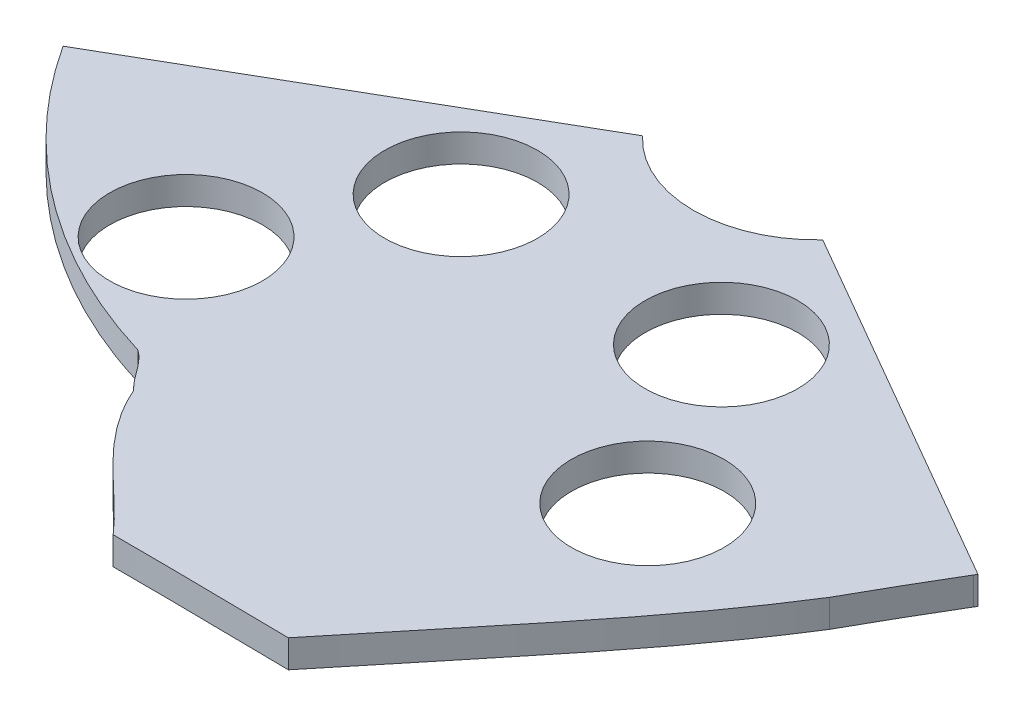
ISO-10303-21;
HEADER;
FILE_DESCRIPTION(('STEP AP214'),'2;1');
FILE_NAME('part.step','',(''),(''),'','','');
FILE_SCHEMA(('AUTOMOTIVE_DESIGN { 1 0 10303 214 1 1 1 1 }'));
ENDSEC;
DATA;
#1=APPLICATION_CONTEXT('core data for automotive mechanical design processes');
#2=APPLICATION_PROTOCOL_DEFINITION('international standard','automotive_design',2000,#1);
#3=PRODUCT_CONTEXT('',#1,'mechanical');
#4=PRODUCT('Part','Part','',(#3));
#5=PRODUCT_RELATED_PRODUCT_CATEGORY('part','',(#4));
#6=PRODUCT_DEFINITION_FORMATION('','',#4);
#7=PRODUCT_DEFINITION_CONTEXT('part definition',#1,'design');
#8=PRODUCT_DEFINITION('design','',#6,#7);
#9=PRODUCT_DEFINITION_SHAPE('','',#8);
#10=(LENGTH_UNIT() NAMED_UNIT(*) SI_UNIT(.MILLI.,.METRE.));
#11=(NAMED_UNIT(*) PLANE_ANGLE_UNIT() SI_UNIT($,.RADIAN.));
#12=(NAMED_UNIT(*) SI_UNIT($,.STERADIAN.) SOLID_ANGLE_UNIT());
#13=UNCERTAINTY_MEASURE_WITH_UNIT(LENGTH_MEASURE(1.E-05),#10,'distance_accuracy_value','');
#14=(GEOMETRIC_REPRESENTATION_CONTEXT(3) GLOBAL_UNCERTAINTY_ASSIGNED_CONTEXT((#13)) GLOBAL_UNIT_ASSIGNED_CONTEXT((#10,
#11,#12)) REPRESENTATION_CONTEXT('',''));
#15=CARTESIAN_POINT('',(0.,0.,0.));
#16=DIRECTION('',(0.,0.,1.));
#17=DIRECTION('',(1.,0.,0.));
#18=AXIS2_PLACEMENT_3D('',#15,#16,#17);
#19=CARTESIAN_POINT('',(-47.1310824648734,-71.7359999999999,62.7768448619572));
#20=DIRECTION('',(0.,-1.,0.));
#21=DIRECTION('',(0.,0.,-1.));
#22=AXIS2_PLACEMENT_3D('',#19,#20,#21);
#23=PLANE('',#22);
#24=CARTESIAN_POINT('',(18.75,-71.7359999999999,32.476));
#25=DIRECTION('',(0.,-1.,0.));
#26=DIRECTION('',(0.,0.,-1.));
#27=AXIS2_PLACEMENT_3D('',#24,#25,#26);
#28=CIRCLE('',#27,10.999845998306);
#29=CARTESIAN_POINT('',(18.75,-71.7359999999999,21.476154001694));
#30=VERTEX_POINT('',#29);
#31=EDGE_CURVE('E441',#30,#30,#28,.T.);
#32=ORIENTED_EDGE('',*,*,#31,.F.);
#33=EDGE_LOOP('',(#32));
#34=FACE_BOUND('',#33,.T.);
#35=CARTESIAN_POINT('',(-33.25,-71.7359999999999,57.591));
#36=DIRECTION('',(0.,-1.,0.));
#37=DIRECTION('',(0.,0.,-1.));
#38=AXIS2_PLACEMENT_3D('',#35,#36,#37);
#39=CIRCLE('',#38,10.999845998306);
#40=CARTESIAN_POINT('',(-33.25,-71.7359999999999,46.591154001694));
#41=VERTEX_POINT('',#40);
#42=EDGE_CURVE('E422',#41,#41,#39,.T.);
#43=ORIENTED_EDGE('',*,*,#42,.F.);
#44=EDGE_LOOP('',(#43));
#45=FACE_BOUND('',#44,.T.);
#46=CARTESIAN_POINT('',(-65.8942438215736,-71.7359999999999,42.6629141284689));
#47=CARTESIAN_POINT('',(-64.6413955635053,-71.7359999999999,44.59728764829));
#48=CARTESIAN_POINT('',(-63.3036796537157,-71.7359999999999,46.4776731400608));
#49=CARTESIAN_POINT('',(-60.4700762133835,-71.7359999999999,50.109948479271));
#50=CARTESIAN_POINT('',(-58.9724775941195,-71.7359999999999,51.8633522477695));
#51=CARTESIAN_POINT('',(-54.2563159243186,-71.7359999999999,56.917988390157));
#52=CARTESIAN_POINT('',(-50.8164013195822,-71.7359999999999,60.0103271048487));
#53=CARTESIAN_POINT('',(-43.4457636101648,-71.7359999999999,65.5433626190657));
#54=CARTESIAN_POINT('',(-39.5161704931453,-71.7359999999999,67.9856871996307));
#55=CARTESIAN_POINT('',(-33.3475212776179,-71.7359999999999,71.102012689813));
#56=CARTESIAN_POINT('',(-31.2442729667969,-71.7359999999999,72.0506458963915));
#57=CARTESIAN_POINT('',(-26.9642380054666,-71.7359999999999,73.7598534142659));
#58=CARTESIAN_POINT('',(-24.7877236211194,-71.7359999999999,74.5197083586423));
#59=CARTESIAN_POINT('',(-22.5811277652207,-71.7359999999999,75.1822390860664));
#60=B_SPLINE_CURVE_WITH_KNOTS('',3,(#46,#47,#48,#49,#50,#51,#52,#53,#54,#55,#56,#57,#58,#59),
.UNSPECIFIED.,.F.,.F.,(4,2,2,2,2,2,4),(1.39491762096711E-06,0.125001394917621,0.250001394917621,
0.500001394917621,0.750001394917621,0.875001394917621,1.),.UNSPECIFIED.);
#61=CARTESIAN_POINT('',(-22.5811277626985,-71.7359999999999,75.1822390776628));
#62=VERTEX_POINT('',#61);
#63=CARTESIAN_POINT('',(-65.8942438215736,-71.7359999999999,42.6629141284689));
#64=VERTEX_POINT('',#63);
#65=EDGE_CURVE('E378',#62,#64,#60,.F.);
#66=ORIENTED_EDGE('',*,*,#65,.T.);
#67=DIRECTION('',(0.866025113443951,0.,-0.500000502884138));
#68=VECTOR('',#67,1.);
#69=CARTESIAN_POINT('',(-65.8942438215736,-71.7359999999999,42.6629141284689));
#70=LINE('',#69,#68);
#71=CARTESIAN_POINT('',(-12.9766531358799,-71.7359999999999,12.1108879302399));
#72=VERTEX_POINT('',#71);
#73=EDGE_CURVE('E103',#64,#72,#70,.T.);
#74=ORIENTED_EDGE('',*,*,#73,.T.);
#75=CARTESIAN_POINT('',(0.,-71.7359999999999,0.));
#76=DIRECTION('',(0.,1.,0.));
#77=DIRECTION('',(0.,0.,-1.));
#78=AXIS2_PLACEMENT_3D('',#75,#76,#77);
#79=CIRCLE('',#78,17.7501305084715);
#80=CARTESIAN_POINT('',(12.9766531358511,-71.7359999999999,12.1108879302707));
#81=VERTEX_POINT('',#80);
#82=EDGE_CURVE('E272',#72,#81,#79,.T.);
#83=ORIENTED_EDGE('',*,*,#82,.T.);
#84=DIRECTION('',(0.866025113442766,0.,0.500000502886192));
#85=VECTOR('',#84,1.);
#86=CARTESIAN_POINT('',(12.9766531358511,-71.7359999999999,12.1108879302707));
#87=LINE('',#86,#85);
#88=CARTESIAN_POINT('',(65.8946490574719,-71.7359999999999,42.6631480920524));
#89=VERTEX_POINT('',#88);
#90=EDGE_CURVE('E249',#81,#89,#87,.T.);
#91=ORIENTED_EDGE('',*,*,#90,.T.);
#92=CARTESIAN_POINT('',(65.6318924245116,-71.7359999999999,43.0663081828138));
#93=CARTESIAN_POINT('',(65.7198896838521,-71.7359999999999,42.932189507071));
#94=CARTESIAN_POINT('',(65.8074758271438,-71.7359999999999,42.797801942139));
#95=CARTESIAN_POINT('',(65.8946490574719,-71.7359999999999,42.6631480920524));
#96=B_SPLINE_CURVE_WITH_KNOTS('',3,(#92,#93,#94,#95),.UNSPECIFIED.,.F.,.F.,(4,4),(0.,
0.999695723473644),.UNSPECIFIED.);
#97=CARTESIAN_POINT('',(65.6318924245119,-71.7359999999999,43.0663081828134));
#98=VERTEX_POINT('',#97);
#99=EDGE_CURVE('E244',#89,#98,#96,.F.);
#100=ORIENTED_EDGE('',*,*,#99,.T.);
#101=CARTESIAN_POINT('',(58.0687104771123,-71.7359999999999,56.2005206813061));
#102=CARTESIAN_POINT('',(60.1722051159026,-71.7359999999999,52.3125087639168));
#103=CARTESIAN_POINT('',(62.6017558263647,-71.7359999999999,48.238383568742));
#104=CARTESIAN_POINT('',(65.0824933789424,-71.7359999999999,44.0055322072259));
#105=CARTESIAN_POINT('',(65.3620033503782,-71.7359999999999,43.5277952980234));
#106=CARTESIAN_POINT('',(65.5176968402376,-71.7359999999999,43.2615361728797));
#107=CARTESIAN_POINT('',(65.5912335378284,-71.7359999999999,43.1358183374974));
#108=CARTESIAN_POINT('',(65.6318924245213,-71.7359999999999,43.0663081828188));
#109=B_SPLINE_CURVE_WITH_KNOTS('',3,(#101,#102,#103,#104,#105,#106,#107,#108),.UNSPECIFIED.,.F.,
.F.,(4,1,1,1,1,4),(-29.4651990795125,-25.9983553398907,-25.742856255887,-25.6151067167765,
-25.5640069012696,-25.5008134722674),.UNSPECIFIED.);
#110=CARTESIAN_POINT('',(58.068710477118,-71.7359999999999,56.2005206812956));
#111=VERTEX_POINT('',#110);
#112=EDGE_CURVE('E321',#98,#111,#109,.F.);
#113=ORIENTED_EDGE('',*,*,#112,.T.);
#114=CARTESIAN_POINT('',(24.130375517784,-71.7359999999999,100.241090371806));
#115=CARTESIAN_POINT('',(24.9043111436865,-71.7359999999999,99.2826721329746));
#116=CARTESIAN_POINT('',(26.4849414032411,-71.7359999999999,97.3252679007572));
#117=CARTESIAN_POINT('',(29.2987149930892,-71.7359999999999,93.8728986852188));
#118=CARTESIAN_POINT('',(32.5724826236708,-71.7359999999999,89.8847259286435));
#119=CARTESIAN_POINT('',(36.2671873102039,-71.7359999999999,85.3962204878607));
#120=CARTESIAN_POINT('',(39.3335159134359,-71.7359999999999,81.645422264559));
#121=CARTESIAN_POINT('',(41.7675003597505,-71.7359999999999,78.6295456299731));
#122=CARTESIAN_POINT('',(44.183826065234,-71.7359999999999,75.6012480960365));
#123=CARTESIAN_POINT('',(47.1635549613513,-71.7359999999999,71.7862460517024));
#124=CARTESIAN_POINT('',(50.6485868893252,-71.7359999999999,67.1410991854537));
#125=CARTESIAN_POINT('',(54.0158805598964,-71.7359999999999,62.4101683503268));
#126=CARTESIAN_POINT('',(56.4601277290054,-71.7359999999999,58.742380281409));
#127=CARTESIAN_POINT('',(57.7840176270259,-71.7359999999999,56.6546374378668));
#128=CARTESIAN_POINT('',(58.068710477118,-71.7359999999999,56.2005206812956));
#129=B_SPLINE_CURVE_WITH_KNOTS('',3,(#114,#115,#116,#117,#118,#119,#120,#121,#122,#123,#124,
#125,#126,#127,#128),.UNSPECIFIED.,.F.,.F.,(4,1,1,1,1,1,1,1,1,1,1,1,4),(0.169263015984021,
0.224443941915799,0.281960556139649,0.368764771643015,0.455569350300839,0.542373095236026,
0.585775244694473,0.629169063938801,0.715911894770024,0.802601993462127,0.889272486309101,
0.975992945989892,1.),.UNSPECIFIED.);
#130=CARTESIAN_POINT('',(24.130375517784,-71.7359999999999,100.241090371806));
#131=VERTEX_POINT('',#130);
#132=EDGE_CURVE('E129',#111,#131,#129,.F.);
#133=ORIENTED_EDGE('',*,*,#132,.T.);
#134=CARTESIAN_POINT('',(24.1303755177467,-71.7359999999999,100.241090371805));
#135=CARTESIAN_POINT('',(16.508361533209,-71.7359999999999,100.189027866263));
#136=CARTESIAN_POINT('',(7.97667623288478,-71.7359999999999,99.9868578914391));
#137=CARTESIAN_POINT('',(-0.890825507183887,-71.7359999999999,100.000861704455));
#138=CARTESIAN_POINT('',(-1.33742039261911,-71.736,100.002062391821));
#139=B_SPLINE_CURVE_WITH_KNOTS('',3,(#134,#135,#136,#137,#138),.UNSPECIFIED.,.F.,.F.,(4,1,4),
(1.32964670389729E-05,0.94972400513588,1.0000010448234),.UNSPECIFIED.);
#140=CARTESIAN_POINT('',(-1.33742039261914,-71.736,100.002062391821));
#141=VERTEX_POINT('',#140);
#142=EDGE_CURVE('E122',#131,#141,#139,.T.);
#143=ORIENTED_EDGE('',*,*,#142,.T.);
#144=CARTESIAN_POINT('',(-17.8511479049751,-71.7359999999999,80.5452798776183));
#145=CARTESIAN_POINT('',(-17.8174918743432,-71.7359999999999,80.624059663613));
#146=CARTESIAN_POINT('',(-17.7498796053171,-71.7359999999999,80.7823229443452));
#147=CARTESIAN_POINT('',(-17.5234949065348,-71.7359999999999,81.2916172430318));
#148=CARTESIAN_POINT('',(-17.1435747512602,-71.7359999999999,82.0814151777423));
#149=CARTESIAN_POINT('',(-16.3939321800935,-71.7359999999999,83.4669396584856));
#150=CARTESIAN_POINT('',(-15.342906448,-71.7359999999999,85.1372056526867));
#151=CARTESIAN_POINT('',(-13.9479819704468,-71.7359999999999,87.0283505308614));
#152=CARTESIAN_POINT('',(-12.6925930701013,-71.7359999999999,88.5279782177932));
#153=CARTESIAN_POINT('',(-11.6434923076902,-71.7359999999999,89.6900986407658));
#154=CARTESIAN_POINT('',(-10.5659723556349,-71.7359999999999,90.8325728795034));
#155=CARTESIAN_POINT('',(-9.17742924397825,-71.7359999999999,92.2246052640169));
#156=CARTESIAN_POINT('',(-7.47172423871944,-71.7359999999999,93.8569174236699));
#157=CARTESIAN_POINT('',(-5.7527906177986,-71.7359999999999,95.4760404655401));
#158=CARTESIAN_POINT('',(-4.32713375447059,-71.7359999999999,96.8448954058809));
#159=CARTESIAN_POINT('',(-3.21646537263792,-71.7359999999999,97.9597859059709));
#160=CARTESIAN_POINT('',(-2.54701614438708,-71.7359999999999,98.6589465604221));
#161=CARTESIAN_POINT('',(-2.04240500571773,-71.7359999999999,99.2059408943311));
#162=CARTESIAN_POINT('',(-1.68442856608542,-71.7359999999999,99.6031959691122));
#163=CARTESIAN_POINT('',(-1.45243736629048,-71.7359999999999,99.8698568325127));
#164=CARTESIAN_POINT('',(-1.33742039086623,-71.7359999999999,100.002062390296));
#165=B_SPLINE_CURVE_WITH_KNOTS('',3,(#144,#145,#146,#147,#148,#149,#150,#151,#152,#153,#154,
#155,#156,#157,#158,#159,#160,#161,#162,#163,#164),.UNSPECIFIED.,.F.,.F.,(4,1,1,1,1,1,1,1,1,1,1,
1,1,1,1,1,1,1,4),(-1.04563691039061E-10,0.010004210583072,0.0200977649767112,0.0650854645038581,
0.112308259416784,0.204007043492902,0.295266180018061,0.38654139555933,0.432273044499713,
0.478088062205558,0.569925335347918,0.661842455225799,0.753787764007906,0.845696991419321,
0.892632635737396,0.937557512176796,0.958727548093413,0.979539471836584,1.00000316402465),.UNSPECIFIED.);
#166=CARTESIAN_POINT('',(-17.8511479049751,-71.7359999999999,80.5452798776183));
#167=VERTEX_POINT('',#166);
#168=EDGE_CURVE('E126',#141,#167,#165,.F.);
#169=ORIENTED_EDGE('',*,*,#168,.T.);
#170=CARTESIAN_POINT('',(-22.5811277626985,-71.7359999999999,75.1822390776628));
#171=CARTESIAN_POINT('',(-22.516038303485,-71.7359999999999,75.2320188037198));
#172=CARTESIAN_POINT('',(-22.3910251349875,-71.7359999999999,75.3276275452352));
#173=CARTESIAN_POINT('',(-22.1683350529378,-71.7359999999999,75.5089711973434));
#174=CARTESIAN_POINT('',(-21.7856676058365,-71.7359999999999,75.8413221960591));
#175=CARTESIAN_POINT('',(-21.2657192692755,-71.7359999999999,76.3597109940921));
#176=CARTESIAN_POINT('',(-20.6791200431121,-71.7359999999999,77.0516470975075));
#177=CARTESIAN_POINT('',(-20.2234801974196,-71.7359999999999,77.6560140003167));
#178=CARTESIAN_POINT('',(-19.8657582153538,-71.7359999999999,78.1460899862871));
#179=CARTESIAN_POINT('',(-19.5078833116472,-71.7359999999999,78.6367695139378));
#180=CARTESIAN_POINT('',(-19.0520298070528,-71.7359999999999,79.2434719960803));
#181=CARTESIAN_POINT('',(-18.5635247329674,-71.7359999999999,79.8245328774133));
#182=CARTESIAN_POINT('',(-18.2061049318891,-71.7359999999999,80.2010547974002));
#183=CARTESIAN_POINT('',(-18.0019325959271,-71.7359999999999,80.4031392129246));
#184=CARTESIAN_POINT('',(-17.9031763162864,-71.7359999999999,80.4962345927212));
#185=CARTESIAN_POINT('',(-17.8511479049752,-71.7359999999999,80.5452798776184));
#186=B_SPLINE_CURVE_WITH_KNOTS('',3,(#170,#171,#172,#173,#174,#175,#176,#177,#178,#179,#180,
#181,#182,#183,#184,#185),.UNSPECIFIED.,.F.,.F.,(4,1,1,1,1,1,1,1,1,1,1,1,1,4),
(1.79800188937485E-05,0.0342819777587222,0.0658266527995001,0.120093174425607,0.246178917628165,
0.372369003643859,0.499112220875021,0.562602916101528,0.626093834537986,0.753076028245098,
0.879882757394803,0.943249091058549,0.970101770327288,1.),.UNSPECIFIED.);
#187=EDGE_CURVE('E51',#167,#62,#186,.F.);
#188=ORIENTED_EDGE('',*,*,#187,.T.);
#189=EDGE_LOOP('',(#66,#74,#83,#91,#100,#113,#133,#143,#169,#188));
#190=FACE_BOUND('',#189,.T.);
#191=CARTESIAN_POINT('',(33.25,-71.7359999999999,57.591));
#192=DIRECTION('',(0.,-1.,0.));
#193=DIRECTION('',(0.,0.,-1.));
#194=AXIS2_PLACEMENT_3D('',#191,#192,#193);
#195=CIRCLE('',#194,10.999845998306);
#196=CARTESIAN_POINT('',(33.25,-71.7359999999999,46.591154001694));
#197=VERTEX_POINT('',#196);
#198=EDGE_CURVE('E429',#197,#197,#195,.T.);
#199=ORIENTED_EDGE('',*,*,#198,.F.);
#200=EDGE_LOOP('',(#199));
#201=FACE_BOUND('',#200,.T.);
#202=CARTESIAN_POINT('',(-18.75,-71.7359999999999,32.476));
#203=DIRECTION('',(0.,-1.,0.));
#204=DIRECTION('',(0.,0.,-1.));
#205=AXIS2_PLACEMENT_3D('',#202,#203,#204);
#206=CIRCLE('',#205,10.999845998306);
#207=CARTESIAN_POINT('',(-18.75,-71.7359999999999,21.476154001694));
#208=VERTEX_POINT('',#207);
#209=EDGE_CURVE('E447',#208,#208,#206,.T.);
#210=ORIENTED_EDGE('',*,*,#209,.F.);
#211=EDGE_LOOP('',(#210));
#212=FACE_BOUND('',#211,.T.);
#213=ADVANCED_FACE('F30',(#34,#45,#190,#201,#212),#23,.T.);
#214=CARTESIAN_POINT('',(-47.1310824648734,-67.7359999999999,62.7768448619572));
#215=DIRECTION('',(0.,-1.,0.));
#216=DIRECTION('',(0.,0.,-1.));
#217=AXIS2_PLACEMENT_3D('',#214,#215,#216);
#218=PLANE('',#217);
#219=CARTESIAN_POINT('',(18.75,-67.7359999999999,32.476));
#220=DIRECTION('',(0.,-1.,0.));
#221=DIRECTION('',(0.,0.,-1.));
#222=AXIS2_PLACEMENT_3D('',#219,#220,#221);
#223=CIRCLE('',#222,10.999845998306);
#224=CARTESIAN_POINT('',(18.75,-67.7359999999999,21.476154001694));
#225=VERTEX_POINT('',#224);
#226=EDGE_CURVE('E444',#225,#225,#223,.T.);
#227=ORIENTED_EDGE('',*,*,#226,.T.);
#228=EDGE_LOOP('',(#227));
#229=FACE_BOUND('',#228,.T.);
#230=CARTESIAN_POINT('',(-33.25,-67.7359999999999,57.591));
#231=DIRECTION('',(0.,-1.,0.));
#232=DIRECTION('',(0.,0.,-1.));
#233=AXIS2_PLACEMENT_3D('',#230,#231,#232);
#234=CIRCLE('',#233,10.999845998306);
#235=CARTESIAN_POINT('',(-33.25,-67.7359999999999,46.591154001694));
#236=VERTEX_POINT('',#235);
#237=EDGE_CURVE('E424',#236,#236,#234,.T.);
#238=ORIENTED_EDGE('',*,*,#237,.T.);
#239=EDGE_LOOP('',(#238));
#240=FACE_BOUND('',#239,.T.);
#241=CARTESIAN_POINT('',(-22.5811277652207,-67.7359999999999,75.1822390860664));
#242=CARTESIAN_POINT('',(-24.7877236211194,-67.7359999999999,74.5197083586423));
#243=CARTESIAN_POINT('',(-26.9642380054666,-67.7359999999999,73.7598534142659));
#244=CARTESIAN_POINT('',(-31.2442729667969,-67.7359999999999,72.0506458963915));
#245=CARTESIAN_POINT('',(-33.3475212776179,-67.7359999999999,71.102012689813));
#246=CARTESIAN_POINT('',(-39.5161704931453,-67.7359999999999,67.9856871996307));
#247=CARTESIAN_POINT('',(-43.4457636101648,-67.7359999999999,65.5433626190657));
#248=CARTESIAN_POINT('',(-50.8164013195822,-67.7359999999999,60.0103271048487));
#249=CARTESIAN_POINT('',(-54.2563159243186,-67.7359999999999,56.917988390157));
#250=CARTESIAN_POINT('',(-58.9724775941195,-67.7359999999999,51.8633522477695));
#251=CARTESIAN_POINT('',(-60.4700762133835,-67.7359999999999,50.109948479271));
#252=CARTESIAN_POINT('',(-63.3036796537157,-67.7359999999999,46.4776731400608));
#253=CARTESIAN_POINT('',(-64.6413955635053,-67.7359999999999,44.59728764829));
#254=CARTESIAN_POINT('',(-65.8942438215736,-67.7359999999999,42.6629141284689));
#255=B_SPLINE_CURVE_WITH_KNOTS('',3,(#241,#242,#243,#244,#245,#246,#247,#248,#249,#250,#251,
#252,#253,#254),.UNSPECIFIED.,.F.,.F.,(4,2,2,2,2,2,4),(1.39491762096184E-06,0.125,0.25,0.5,0.75,
0.875,1.),.UNSPECIFIED.);
#256=CARTESIAN_POINT('',(-22.5811277626985,-67.7359999999999,75.1822390776628));
#257=VERTEX_POINT('',#256);
#258=CARTESIAN_POINT('',(-65.8942438215736,-67.7359999999999,42.6629141284689));
#259=VERTEX_POINT('',#258);
#260=EDGE_CURVE('E405',#257,#259,#255,.T.);
#261=ORIENTED_EDGE('',*,*,#260,.F.);
#262=CARTESIAN_POINT('',(-17.8511479049752,-67.7359999999997,80.5452798776184));
#263=CARTESIAN_POINT('',(-17.9031763162864,-67.7359999999997,80.4962345927212));
#264=CARTESIAN_POINT('',(-18.0019325959271,-67.7359999999997,80.4031392129246));
#265=CARTESIAN_POINT('',(-18.2061049318891,-67.7359999999997,80.2010547974002));
#266=CARTESIAN_POINT('',(-18.5635247329674,-67.7359999999997,79.8245328774133));
#267=CARTESIAN_POINT('',(-19.0520298070528,-67.7359999999997,79.2434719960803));
#268=CARTESIAN_POINT('',(-19.5078833116472,-67.7359999999997,78.6367695139378));
#269=CARTESIAN_POINT('',(-19.8657582153538,-67.7359999999997,78.1460899862871));
#270=CARTESIAN_POINT('',(-20.2234801974196,-67.7359999999997,77.6560140003167));
#271=CARTESIAN_POINT('',(-20.6791200431121,-67.7359999999997,77.0516470975075));
#272=CARTESIAN_POINT('',(-21.2657192692755,-67.7359999999997,76.3597109940921));
#273=CARTESIAN_POINT('',(-21.7856676058365,-67.7359999999997,75.8413221960591));
#274=CARTESIAN_POINT('',(-22.1683350529378,-67.7359999999997,75.5089711973434));
#275=CARTESIAN_POINT('',(-22.3910251349875,-67.7359999999997,75.3276275452352));
#276=CARTESIAN_POINT('',(-22.516038303485,-67.7359999999997,75.2320188037198));
#277=CARTESIAN_POINT('',(-22.5811277626985,-67.7359999999997,75.1822390776628));
#278=B_SPLINE_CURVE_WITH_KNOTS('',3,(#262,#263,#264,#265,#266,#267,#268,#269,#270,#271,#272,
#273,#274,#275,#276,#277),.UNSPECIFIED.,.F.,.F.,(4,1,1,1,1,1,1,1,1,1,1,1,1,4),
(1.79800188938065E-05,0.0299162096916062,0.0567688889603452,0.120135222624091,0.246941951773795,
0.373924145480908,0.437415063917365,0.500905759143873,0.627648976375035,0.753839062390729,
0.879924805593287,0.934191327219394,0.965736002260172,1.),.UNSPECIFIED.);
#279=CARTESIAN_POINT('',(-17.8511479049751,-67.7359999999999,80.5452798776183));
#280=VERTEX_POINT('',#279);
#281=EDGE_CURVE('E94',#280,#257,#278,.T.);
#282=ORIENTED_EDGE('',*,*,#281,.F.);
#283=CARTESIAN_POINT('',(-1.33742039086623,-67.7359999999999,100.002062390296));
#284=CARTESIAN_POINT('',(-1.45243736629048,-67.7359999999999,99.8698568325127));
#285=CARTESIAN_POINT('',(-1.68442856608542,-67.7359999999999,99.6031959691122));
#286=CARTESIAN_POINT('',(-2.04240500571773,-67.7359999999999,99.2059408943311));
#287=CARTESIAN_POINT('',(-2.54701614438708,-67.7359999999999,98.6589465604221));
#288=CARTESIAN_POINT('',(-3.21646537263792,-67.7359999999999,97.9597859059709));
#289=CARTESIAN_POINT('',(-4.32713375447059,-67.7359999999999,96.8448954058809));
#290=CARTESIAN_POINT('',(-5.7527906177986,-67.7359999999999,95.4760404655401));
#291=CARTESIAN_POINT('',(-7.47172423871944,-67.7359999999999,93.8569174236699));
#292=CARTESIAN_POINT('',(-9.17742924397825,-67.7359999999999,92.2246052640169));
#293=CARTESIAN_POINT('',(-10.5659723556349,-67.7359999999999,90.8325728795034));
#294=CARTESIAN_POINT('',(-11.6434923076902,-67.7359999999999,89.6900986407658));
#295=CARTESIAN_POINT('',(-12.6925930701013,-67.7359999999999,88.5279782177932));
#296=CARTESIAN_POINT('',(-13.9479819704468,-67.7359999999999,87.0283505308614));
#297=CARTESIAN_POINT('',(-15.342906448,-67.7359999999999,85.1372056526867));
#298=CARTESIAN_POINT('',(-16.3939321800935,-67.7359999999999,83.4669396584856));
#299=CARTESIAN_POINT('',(-17.1435747512602,-67.7359999999999,82.0814151777423));
#300=CARTESIAN_POINT('',(-17.5234949065348,-67.7359999999999,81.2916172430318));
#301=CARTESIAN_POINT('',(-17.7498796053171,-67.7359999999999,80.7823229443452));
#302=CARTESIAN_POINT('',(-17.8174918743432,-67.7359999999999,80.624059663613));
#303=CARTESIAN_POINT('',(-17.8511479049751,-67.7359999999999,80.5452798776183));
#304=B_SPLINE_CURVE_WITH_KNOTS('',3,(#283,#284,#285,#286,#287,#288,#289,#290,#291,#292,#293,
#294,#295,#296,#297,#298,#299,#300,#301,#302,#303),.UNSPECIFIED.,.F.,.F.,(4,1,1,1,1,1,1,1,1,1,1,
1,1,1,1,1,1,1,4),(-1.04563656949532E-10,0.0204636920835041,0.0412756158266749,
0.0624456517432918,0.107370528182692,0.154306172500768,0.246215399912182,0.338160708694289,
0.43007782857217,0.52191510171453,0.567730119420375,0.613461768360758,0.704736983902027,
0.795996120427186,0.887694904503304,0.93491769941623,0.979905398943377,0.989998953337016,
1.00000316402465),.UNSPECIFIED.);
#305=CARTESIAN_POINT('',(-1.33742039261914,-67.736,100.002062391821));
#306=VERTEX_POINT('',#305);
#307=EDGE_CURVE('E87',#306,#280,#304,.T.);
#308=ORIENTED_EDGE('',*,*,#307,.F.);
#309=CARTESIAN_POINT('',(24.1303755177467,-67.7359999999999,100.241090371805));
#310=CARTESIAN_POINT('',(16.508361533209,-67.7359999999999,100.189027866263));
#311=CARTESIAN_POINT('',(7.97667623288478,-67.7359999999999,99.9868578914391));
#312=CARTESIAN_POINT('',(-0.890825507183887,-67.7359999999999,100.000861704455));
#313=CARTESIAN_POINT('',(-1.33742039261911,-67.736,100.002062391821));
#314=B_SPLINE_CURVE_WITH_KNOTS('',3,(#309,#310,#311,#312,#313),.UNSPECIFIED.,.F.,.F.,(4,1,4),
(1.32964670389729E-05,0.94972400513588,1.0000010448234),.UNSPECIFIED.);
#315=CARTESIAN_POINT('',(24.130375517784,-67.7359999999999,100.241090371806));
#316=VERTEX_POINT('',#315);
#317=EDGE_CURVE('E138',#316,#306,#314,.T.);
#318=ORIENTED_EDGE('',*,*,#317,.F.);
#319=CARTESIAN_POINT('',(58.068710477118,-67.7359999999999,56.2005206812956));
#320=CARTESIAN_POINT('',(57.7840176270259,-67.7359999999999,56.6546374378668));
#321=CARTESIAN_POINT('',(56.4601277290054,-67.7359999999999,58.742380281409));
#322=CARTESIAN_POINT('',(54.0158805598964,-67.7359999999999,62.4101683503268));
#323=CARTESIAN_POINT('',(50.6485868893252,-67.7359999999999,67.1410991854537));
#324=CARTESIAN_POINT('',(47.1635549613513,-67.7359999999999,71.7862460517024));
#325=CARTESIAN_POINT('',(44.183826065234,-67.7359999999999,75.6012480960365));
#326=CARTESIAN_POINT('',(41.7675003597505,-67.7359999999999,78.6295456299731));
#327=CARTESIAN_POINT('',(39.3335159134359,-67.7359999999999,81.645422264559));
#328=CARTESIAN_POINT('',(36.2671873102039,-67.7359999999999,85.3962204878607));
#329=CARTESIAN_POINT('',(32.5724826236708,-67.7359999999999,89.8847259286435));
#330=CARTESIAN_POINT('',(29.2987149930892,-67.7359999999999,93.8728986852188));
#331=CARTESIAN_POINT('',(26.4849414032411,-67.7359999999999,97.3252679007572));
#332=CARTESIAN_POINT('',(24.9043111436865,-67.7359999999999,99.2826721329746));
#333=CARTESIAN_POINT('',(24.130375517784,-67.7359999999999,100.241090371806));
#334=B_SPLINE_CURVE_WITH_KNOTS('',3,(#319,#320,#321,#322,#323,#324,#325,#326,#327,#328,#329,
#330,#331,#332,#333),.UNSPECIFIED.,.F.,.F.,(4,1,1,1,1,1,1,1,1,1,1,1,4),(0.169263015984021,
0.193270069994129,0.27999052967492,0.366661022521894,0.453351121213997,0.54009395204522,
0.583487771289547,0.626889920747995,0.713693665683182,0.800498244341005,0.887302459844372,
0.944819074068222,1.),.UNSPECIFIED.);
#335=CARTESIAN_POINT('',(58.068710477118,-67.7359999999999,56.2005206812956));
#336=VERTEX_POINT('',#335);
#337=EDGE_CURVE('E312',#336,#316,#334,.T.);
#338=ORIENTED_EDGE('',*,*,#337,.F.);
#339=CARTESIAN_POINT('',(65.6318924245213,-67.7359999999999,43.0663081828188));
#340=CARTESIAN_POINT('',(65.5912335378284,-67.7359999999999,43.1358183374974));
#341=CARTESIAN_POINT('',(65.5176968402376,-67.7359999999999,43.2615361728797));
#342=CARTESIAN_POINT('',(65.3620033503782,-67.7359999999999,43.5277952980234));
#343=CARTESIAN_POINT('',(65.0824933789424,-67.7359999999999,44.0055322072259));
#344=CARTESIAN_POINT('',(62.6017558263647,-67.7359999999999,48.238383568742));
#345=CARTESIAN_POINT('',(60.1722051159026,-67.7359999999999,52.3125087639168));
#346=CARTESIAN_POINT('',(58.0687104771123,-67.7359999999999,56.2005206813061));
#347=B_SPLINE_CURVE_WITH_KNOTS('',3,(#339,#340,#341,#342,#343,#344,#345,#346),.UNSPECIFIED.,.F.,
.F.,(4,1,1,1,1,4),(-29.4651990795125,-29.4020056505103,-29.3509058350034,-29.2231562958928,
-28.9676572118892,-25.5008134722674),.UNSPECIFIED.);
#348=CARTESIAN_POINT('',(65.6318924245119,-67.7359999999999,43.0663081828134));
#349=VERTEX_POINT('',#348);
#350=EDGE_CURVE('E327',#349,#336,#347,.T.);
#351=ORIENTED_EDGE('',*,*,#350,.F.);
#352=CARTESIAN_POINT('',(65.8946490574719,-67.7359999999999,42.6631480920524));
#353=CARTESIAN_POINT('',(65.8074758271438,-67.7359999999999,42.797801942139));
#354=CARTESIAN_POINT('',(65.7198896838521,-67.7359999999999,42.932189507071));
#355=CARTESIAN_POINT('',(65.6318924245116,-67.7359999999999,43.0663081828138));
#356=B_SPLINE_CURVE_WITH_KNOTS('',3,(#352,#353,#354,#355),.UNSPECIFIED.,.F.,.F.,(4,4),(0.,
0.999695723473644),.UNSPECIFIED.);
#357=CARTESIAN_POINT('',(65.8946490574719,-67.7359999999999,42.6631480920524));
#358=VERTEX_POINT('',#357);
#359=EDGE_CURVE('E363',#358,#349,#356,.T.);
#360=ORIENTED_EDGE('',*,*,#359,.F.);
#361=DIRECTION('',(0.866025113442766,0.,0.500000502886192));
#362=VECTOR('',#361,1.);
#363=CARTESIAN_POINT('',(12.9766531358511,-67.7359999999999,12.1108879302707));
#364=LINE('',#363,#362);
#365=CARTESIAN_POINT('',(12.9766531358511,-67.7359999999999,12.1108879302707));
#366=VERTEX_POINT('',#365);
#367=EDGE_CURVE('E188',#366,#358,#364,.T.);
#368=ORIENTED_EDGE('',*,*,#367,.F.);
#369=CARTESIAN_POINT('',(0.,-67.7359999999999,0.));
#370=DIRECTION('',(0.,1.,0.));
#371=DIRECTION('',(0.,0.,-1.));
#372=AXIS2_PLACEMENT_3D('',#369,#370,#371);
#373=CIRCLE('',#372,17.7501305084715);
#374=CARTESIAN_POINT('',(-12.9766531358799,-67.7359999999999,12.1108879302399));
#375=VERTEX_POINT('',#374);
#376=EDGE_CURVE('E183',#375,#366,#373,.T.);
#377=ORIENTED_EDGE('',*,*,#376,.F.);
#378=DIRECTION('',(0.866025113443951,0.,-0.500000502884138));
#379=VECTOR('',#378,1.);
#380=CARTESIAN_POINT('',(-65.8942438215736,-67.7359999999999,42.6629141284689));
#381=LINE('',#380,#379);
#382=EDGE_CURVE('E189',#259,#375,#381,.T.);
#383=ORIENTED_EDGE('',*,*,#382,.F.);
#384=EDGE_LOOP('',(#261,#282,#308,#318,#338,#351,#360,#368,#377,#383));
#385=FACE_BOUND('',#384,.T.);
#386=CARTESIAN_POINT('',(33.25,-67.7359999999999,57.591));
#387=DIRECTION('',(0.,-1.,0.));
#388=DIRECTION('',(0.,0.,-1.));
#389=AXIS2_PLACEMENT_3D('',#386,#387,#388);
#390=CIRCLE('',#389,10.999845998306);
#391=CARTESIAN_POINT('',(33.25,-67.7359999999999,46.591154001694));
#392=VERTEX_POINT('',#391);
#393=EDGE_CURVE('E432',#392,#392,#390,.T.);
#394=ORIENTED_EDGE('',*,*,#393,.T.);
#395=EDGE_LOOP('',(#394));
#396=FACE_BOUND('',#395,.T.);
#397=CARTESIAN_POINT('',(-18.75,-67.7359999999999,32.476));
#398=DIRECTION('',(0.,-1.,0.));
#399=DIRECTION('',(0.,0.,-1.));
#400=AXIS2_PLACEMENT_3D('',#397,#398,#399);
#401=CIRCLE('',#400,10.999845998306);
#402=CARTESIAN_POINT('',(-18.75,-67.7359999999999,21.476154001694));
#403=VERTEX_POINT('',#402);
#404=EDGE_CURVE('E450',#403,#403,#401,.T.);
#405=ORIENTED_EDGE('',*,*,#404,.T.);
#406=EDGE_LOOP('',(#405));
#407=FACE_BOUND('',#406,.T.);
#408=ADVANCED_FACE('F208',(#229,#240,#385,#396,#407),#218,.F.);
#409=CARTESIAN_POINT('',(-22.5810538919185,-71.7359999999999,75.1822612664964));
#410=CARTESIAN_POINT('',(-24.7876750436405,-71.7359999999999,74.5197253177805));
#411=CARTESIAN_POINT('',(-26.9642141241486,-71.7359999999999,73.7598629511338));
#412=CARTESIAN_POINT('',(-31.2442729667969,-71.7359999999999,72.0506458963915));
#413=CARTESIAN_POINT('',(-33.3475212776179,-71.7359999999999,71.102012689813));
#414=CARTESIAN_POINT('',(-39.5161704931453,-71.7359999999999,67.9856871996307));
#415=CARTESIAN_POINT('',(-43.4457636101648,-71.7359999999999,65.5433626190657));
#416=CARTESIAN_POINT('',(-50.8164013195822,-71.7359999999999,60.0103271048487));
#417=CARTESIAN_POINT('',(-54.2563159243186,-71.7359999999999,56.917988390157));
#418=CARTESIAN_POINT('',(-58.9724775941195,-71.7359999999999,51.8633522477695));
#419=CARTESIAN_POINT('',(-60.4700762133835,-71.7359999999999,50.109948479271));
#420=CARTESIAN_POINT('',(-63.3036796537157,-71.7359999999999,46.4776731400608));
#421=CARTESIAN_POINT('',(-64.6413955635053,-71.7359999999999,44.59728764829));
#422=CARTESIAN_POINT('',(-65.8942438215736,-71.7359999999999,42.6629141284689));
#423=B_SPLINE_CURVE_WITH_KNOTS('',3,(#409,#410,#411,#412,#413,#414,#415,#416,#417,#418,#419,
#420,#421,#422),.UNSPECIFIED.,.F.,.F.,(4,2,2,2,2,2,4),(0.,0.125,0.25,0.5,0.75,0.875,1.),.UNSPECIFIED.);
#424=DIRECTION('',(0.,1.,0.));
#425=VECTOR('',#424,1.);
#426=SURFACE_OF_LINEAR_EXTRUSION('',#423,#425);
#427=ORIENTED_EDGE('',*,*,#260,.T.);
#428=DIRECTION('',(0.,1.,0.));
#429=VECTOR('',#428,1.);
#430=CARTESIAN_POINT('',(-65.8942438215736,-71.7359999999999,42.6629141284689));
#431=LINE('',#430,#429);
#432=EDGE_CURVE('E11',#64,#259,#431,.T.);
#433=ORIENTED_EDGE('',*,*,#432,.F.);
#434=ORIENTED_EDGE('',*,*,#65,.F.);
#435=DIRECTION('',(0.,1.,0.));
#436=VECTOR('',#435,1.);
#437=CARTESIAN_POINT('',(-22.5811277626985,-71.7359999999999,75.1822390776628));
#438=LINE('',#437,#436);
#439=EDGE_CURVE('E652',#62,#257,#438,.T.);
#440=ORIENTED_EDGE('',*,*,#439,.T.);
#441=EDGE_LOOP('',(#427,#433,#434,#440));
#442=FACE_BOUND('',#441,.T.);
#443=ADVANCED_FACE('F32',(#442),#426,.F.);
#444=CARTESIAN_POINT('',(-65.8942438215736,-71.7359999999999,42.6629141284689));
#445=DIRECTION('',(0.500000502884138,0.,0.866025113443951));
#446=DIRECTION('',(0.866025113443951,0.,-0.500000502884138));
#447=AXIS2_PLACEMENT_3D('',#444,#445,#446);
#448=PLANE('',#447);
#449=ORIENTED_EDGE('',*,*,#382,.T.);
#450=DIRECTION('',(0.,1.,0.));
#451=VECTOR('',#450,1.);
#452=CARTESIAN_POINT('',(-12.9766531358799,-71.7359999999999,12.1108879302399));
#453=LINE('',#452,#451);
#454=EDGE_CURVE('E42',#72,#375,#453,.T.);
#455=ORIENTED_EDGE('',*,*,#454,.F.);
#456=ORIENTED_EDGE('',*,*,#73,.F.);
#457=ORIENTED_EDGE('',*,*,#432,.T.);
#458=EDGE_LOOP('',(#449,#455,#456,#457));
#459=FACE_BOUND('',#458,.T.);
#460=ADVANCED_FACE('F469',(#459),#448,.F.);
#461=CARTESIAN_POINT('',(0.,-71.7359999999999,0.));
#462=DIRECTION('',(0.,1.,0.));
#463=DIRECTION('',(0.,0.,1.));
#464=AXIS2_PLACEMENT_3D('',#461,#462,#463);
#465=CYLINDRICAL_SURFACE('',#464,17.7501305084715);
#466=ORIENTED_EDGE('',*,*,#376,.T.);
#467=DIRECTION('',(0.,1.,0.));
#468=VECTOR('',#467,1.);
#469=CARTESIAN_POINT('',(12.9766531358511,-71.7359999999999,12.1108879302707));
#470=LINE('',#469,#468);
#471=EDGE_CURVE('E190',#81,#366,#470,.T.);
#472=ORIENTED_EDGE('',*,*,#471,.F.);
#473=ORIENTED_EDGE('',*,*,#82,.F.);
#474=ORIENTED_EDGE('',*,*,#454,.T.);
#475=EDGE_LOOP('',(#466,#472,#473,#474));
#476=FACE_BOUND('',#475,.T.);
#477=ADVANCED_FACE('F517',(#476),#465,.F.);
#478=CARTESIAN_POINT('',(12.9766531358511,-71.7359999999999,12.1108879302707));
#479=DIRECTION('',(-0.500000502886192,0.,0.866025113442766));
#480=DIRECTION('',(0.866025113442766,0.,0.500000502886192));
#481=AXIS2_PLACEMENT_3D('',#478,#479,#480);
#482=PLANE('',#481);
#483=ORIENTED_EDGE('',*,*,#367,.T.);
#484=DIRECTION('',(0.,1.,0.));
#485=VECTOR('',#484,1.);
#486=CARTESIAN_POINT('',(65.8946490574719,-71.7359999999999,42.6631480920524));
#487=LINE('',#486,#485);
#488=EDGE_CURVE('E193',#89,#358,#487,.T.);
#489=ORIENTED_EDGE('',*,*,#488,.F.);
#490=ORIENTED_EDGE('',*,*,#90,.F.);
#491=ORIENTED_EDGE('',*,*,#471,.T.);
#492=EDGE_LOOP('',(#483,#489,#490,#491));
#493=FACE_BOUND('',#492,.T.);
#494=ADVANCED_FACE('F263',(#493),#482,.F.);
#495=CARTESIAN_POINT('',(65.8946490574719,-71.7359999999999,42.6631480920524));
#496=CARTESIAN_POINT('',(65.8074492943028,-71.7359999999999,42.7978429266154));
#497=CARTESIAN_POINT('',(65.7198363667759,-71.7359999999999,42.9322713139012));
#498=CARTESIAN_POINT('',(65.6318120734472,-71.7359999999999,43.0664306474966));
#499=B_SPLINE_CURVE_WITH_KNOTS('',3,(#495,#496,#497,#498),.UNSPECIFIED.,.F.,.F.,(4,4),(0.,1.),.UNSPECIFIED.);
#500=DIRECTION('',(0.,1.,0.));
#501=VECTOR('',#500,1.);
#502=SURFACE_OF_LINEAR_EXTRUSION('',#499,#501);
#503=ORIENTED_EDGE('',*,*,#359,.T.);
#504=DIRECTION('',(0.,1.,0.));
#505=VECTOR('',#504,1.);
#506=CARTESIAN_POINT('',(65.6318924245119,-71.7359999999999,43.0663081828134));
#507=LINE('',#506,#505);
#508=EDGE_CURVE('E329',#98,#349,#507,.T.);
#509=ORIENTED_EDGE('',*,*,#508,.F.);
#510=ORIENTED_EDGE('',*,*,#99,.F.);
#511=ORIENTED_EDGE('',*,*,#488,.T.);
#512=EDGE_LOOP('',(#503,#509,#510,#511));
#513=FACE_BOUND('',#512,.T.);
#514=ADVANCED_FACE('F251',(#513),#502,.F.);
#515=CARTESIAN_POINT('',(-1569.4554932376,-71.7359999999999,-1104.5505998346));
#516=CARTESIAN_POINT('',(123.468603889664,-71.7359999999999,-50.0184783711937));
#517=CARTESIAN_POINT('',(93.1876607899681,-71.7359999999999,-4.05823551870026));
#518=CARTESIAN_POINT('',(65.3620033503782,-71.7359999999999,43.5277952980234));
#519=CARTESIAN_POINT('',(65.0824933789424,-71.7359999999999,44.0055322072259));
#520=CARTESIAN_POINT('',(17.8098349572808,-71.7359999999999,124.666276168109));
#521=CARTESIAN_POINT('',(-41.4303505938273,-71.7359999999999,198.11129383452));
#522=CARTESIAN_POINT('',(1625.65821493319,-71.7359999999999,1284.82315736767));
#523=B_SPLINE_CURVE_WITH_KNOTS('',3,(#515,#516,#517,#518,#519,#520,#521,#522),.UNSPECIFIED.,.F.,
.F.,(4,1,1,1,1,4),(-72.4812243680169,-29.4020056505103,-29.3509058350034,-29.2231562958928,
-28.9676572118892,44.0160252885046),.UNSPECIFIED.);
#524=DIRECTION('',(0.,1.,0.));
#525=VECTOR('',#524,1.);
#526=SURFACE_OF_LINEAR_EXTRUSION('',#523,#525);
#527=ORIENTED_EDGE('',*,*,#350,.T.);
#528=DIRECTION('',(0.,1.,0.));
#529=VECTOR('',#528,1.);
#530=CARTESIAN_POINT('',(58.068710477118,-71.7359999999999,56.2005206812956));
#531=LINE('',#530,#529);
#532=EDGE_CURVE('E326',#111,#336,#531,.T.);
#533=ORIENTED_EDGE('',*,*,#532,.F.);
#534=ORIENTED_EDGE('',*,*,#112,.F.);
#535=ORIENTED_EDGE('',*,*,#508,.T.);
#536=EDGE_LOOP('',(#527,#533,#534,#535));
#537=FACE_BOUND('',#536,.T.);
#538=ADVANCED_FACE('F262',(#537),#526,.F.);
#539=CARTESIAN_POINT('',(63.6976006942556,-71.7359999999999,46.3636576068528));
#540=CARTESIAN_POINT('',(63.5965735405576,-71.7359999999999,46.55902615376));
#541=CARTESIAN_POINT('',(63.3942099302679,-71.7359999999999,46.9503613843595));
#542=CARTESIAN_POINT('',(62.3105419142047,-71.7359999999999,49.010683256892));
#543=CARTESIAN_POINT('',(60.3114283228076,-71.7359999999999,52.5859545017264));
#544=CARTESIAN_POINT('',(57.264807201841,-71.7359999999999,57.5348944726619));
#545=CARTESIAN_POINT('',(54.0158805598964,-71.7359999999999,62.4101683503268));
#546=CARTESIAN_POINT('',(50.6485868893252,-71.7359999999999,67.1410991854537));
#547=CARTESIAN_POINT('',(47.1635549613513,-71.7359999999999,71.7862460517024));
#548=CARTESIAN_POINT('',(44.183826065234,-71.7359999999999,75.6012480960365));
#549=CARTESIAN_POINT('',(41.7675003597505,-71.7359999999999,78.6295456299731));
#550=CARTESIAN_POINT('',(39.3335159134359,-71.7359999999999,81.645422264559));
#551=CARTESIAN_POINT('',(36.2671873102039,-71.7359999999999,85.3962204878607));
#552=CARTESIAN_POINT('',(32.5724826236708,-71.7359999999999,89.8847259286435));
#553=CARTESIAN_POINT('',(29.2987149930892,-71.7359999999999,93.8728986852188));
#554=CARTESIAN_POINT('',(26.4849414032411,-71.7359999999999,97.3252679007572));
#555=CARTESIAN_POINT('',(24.9043111436865,-71.7359999999999,99.2826721329746));
#556=CARTESIAN_POINT('',(24.130375517784,-71.7359999999999,100.241090371806));
#557=B_SPLINE_CURVE_WITH_KNOTS('',3,(#539,#540,#541,#542,#543,#544,#545,#546,#547,#548,#549,
#550,#551,#552,#553,#554,#555,#556),.UNSPECIFIED.,.F.,.F.,(4,1,1,1,1,1,1,1,1,1,1,1,1,1,1,4),(0.,
0.00985211907020404,0.0197344012087224,0.104276902530695,0.193270069994129,0.27999052967492,
0.366661022521894,0.453351121213997,0.54009395204522,0.583487771289547,0.626889920747995,
0.713693665683182,0.800498244341005,0.887302459844372,0.944819074068222,1.),.UNSPECIFIED.);
#558=DIRECTION('',(0.,1.,0.));
#559=VECTOR('',#558,1.);
#560=SURFACE_OF_LINEAR_EXTRUSION('',#557,#559);
#561=ORIENTED_EDGE('',*,*,#337,.T.);
#562=DIRECTION('',(0.,1.,0.));
#563=VECTOR('',#562,1.);
#564=CARTESIAN_POINT('',(24.130375517784,-71.7359999999999,100.241090371806));
#565=LINE('',#564,#563);
#566=EDGE_CURVE('E139',#131,#316,#565,.T.);
#567=ORIENTED_EDGE('',*,*,#566,.F.);
#568=ORIENTED_EDGE('',*,*,#132,.F.);
#569=ORIENTED_EDGE('',*,*,#532,.T.);
#570=EDGE_LOOP('',(#561,#567,#568,#569));
#571=FACE_BOUND('',#570,.T.);
#572=ADVANCED_FACE('F288',(#571),#560,.F.);
#573=DIRECTION('',(0.,1.,0.));
#574=VECTOR('',#573,1.);
#575=SURFACE_OF_LINEAR_EXTRUSION('',#139,#574);
#576=ORIENTED_EDGE('',*,*,#317,.T.);
#577=DIRECTION('',(0.,1.,0.));
#578=VECTOR('',#577,1.);
#579=CARTESIAN_POINT('',(-1.33742039261914,-71.736,100.002062391821));
#580=LINE('',#579,#578);
#581=EDGE_CURVE('E135',#141,#306,#580,.T.);
#582=ORIENTED_EDGE('',*,*,#581,.F.);
#583=ORIENTED_EDGE('',*,*,#142,.F.);
#584=ORIENTED_EDGE('',*,*,#566,.T.);
#585=EDGE_LOOP('',(#576,#582,#583,#584));
#586=FACE_BOUND('',#585,.T.);
#587=ADVANCED_FACE('F136',(#586),#575,.F.);
#588=CARTESIAN_POINT('',(1535.65691946777,-71.7359999999999,-1179.24279714283));
#589=CARTESIAN_POINT('',(10.100392962579,-71.7359999999999,140.926581363582));
#590=CARTESIAN_POINT('',(11.1792493210134,-71.7359999999999,113.878329065158));
#591=CARTESIAN_POINT('',(-2.04240500571773,-71.7359999999999,99.2059408943311));
#592=CARTESIAN_POINT('',(-2.54701614438708,-71.7359999999999,98.6589465604221));
#593=CARTESIAN_POINT('',(-3.21646537263792,-71.7359999999999,97.9597859059709));
#594=CARTESIAN_POINT('',(-4.32713375447059,-71.7359999999999,96.8448954058809));
#595=CARTESIAN_POINT('',(-5.7527906177986,-71.7359999999999,95.4760404655401));
#596=CARTESIAN_POINT('',(-7.47172423871944,-71.7359999999999,93.8569174236699));
#597=CARTESIAN_POINT('',(-9.17742924397825,-71.7359999999999,92.2246052640169));
#598=CARTESIAN_POINT('',(-10.5659723556349,-71.7359999999999,90.8325728795034));
#599=CARTESIAN_POINT('',(-11.6434923076902,-71.7359999999999,89.6900986407658));
#600=CARTESIAN_POINT('',(-12.6925930701013,-71.7359999999999,88.5279782177932));
#601=CARTESIAN_POINT('',(-13.9479819704468,-71.7359999999999,87.0283505308614));
#602=CARTESIAN_POINT('',(-15.342906448,-71.7359999999999,85.1372056526867));
#603=CARTESIAN_POINT('',(-16.3939321800935,-71.7359999999999,83.4669396584856));
#604=CARTESIAN_POINT('',(-17.1435747512602,-71.7359999999999,82.0814151777423));
#605=CARTESIAN_POINT('',(-17.5234949065348,-71.7359999999999,81.2916172430318));
#606=CARTESIAN_POINT('',(-22.8914792919728,-71.7359999999999,69.2153423991609));
#607=CARTESIAN_POINT('',(-15.3580789572076,-71.7359999999999,51.9438183284806));
#608=CARTESIAN_POINT('',(-1866.34782444904,-71.7359999999999,843.697251743966));
#609=B_SPLINE_CURVE_WITH_KNOTS('',3,(#588,#589,#590,#591,#592,#593,#594,#595,#596,#597,#598,
#599,#600,#601,#602,#603,#604,#605,#606,#607,#608),.UNSPECIFIED.,.F.,.F.,(4,1,1,1,1,1,1,1,1,1,1,
1,1,1,1,1,1,1,4),(-2.24394865674182,0.0204636920835041,0.0412756158266749,0.0624456517432918,
0.107370528182692,0.154306172500768,0.246215399912182,0.338160708694289,0.43007782857217,
0.52191510171453,0.567730119420375,0.613461768360758,0.704736983902027,0.795996120427186,
0.887694904503304,0.93491769941623,0.979905398943377,0.989998953337016,2.4782099785156),.UNSPECIFIED.);
#610=DIRECTION('',(0.,1.,0.));
#611=VECTOR('',#610,1.);
#612=SURFACE_OF_LINEAR_EXTRUSION('',#609,#611);
#613=ORIENTED_EDGE('',*,*,#307,.T.);
#614=DIRECTION('',(0.,1.,0.));
#615=VECTOR('',#614,1.);
#616=CARTESIAN_POINT('',(-17.8511479049751,-71.7359999999999,80.5452798776183));
#617=LINE('',#616,#615);
#618=EDGE_CURVE('E140',#167,#280,#617,.T.);
#619=ORIENTED_EDGE('',*,*,#618,.F.);
#620=ORIENTED_EDGE('',*,*,#168,.F.);
#621=ORIENTED_EDGE('',*,*,#581,.T.);
#622=EDGE_LOOP('',(#613,#619,#620,#621));
#623=FACE_BOUND('',#622,.T.);
#624=ADVANCED_FACE('F143',(#623),#612,.F.);
#625=CARTESIAN_POINT('',(-17.8510540393686,-71.7359999999999,80.5453683613001));
#626=CARTESIAN_POINT('',(-17.9031137394454,-71.7359999999999,80.4962935820814));
#627=CARTESIAN_POINT('',(-18.001902033933,-71.7359999999999,80.4031694623836));
#628=CARTESIAN_POINT('',(-18.2061049318891,-71.7359999999999,80.2010547974002));
#629=CARTESIAN_POINT('',(-18.5635247329674,-71.7359999999999,79.8245328774133));
#630=CARTESIAN_POINT('',(-19.0520298070528,-71.7359999999999,79.2434719960803));
#631=CARTESIAN_POINT('',(-19.5078833116472,-71.7359999999999,78.6367695139378));
#632=CARTESIAN_POINT('',(-19.8657582153538,-71.7359999999999,78.1460899862871));
#633=CARTESIAN_POINT('',(-20.2234801974196,-71.7359999999999,77.6560140003167));
#634=CARTESIAN_POINT('',(-20.6791200431121,-71.7359999999999,77.0516470975075));
#635=CARTESIAN_POINT('',(-21.2657192692755,-71.7359999999999,76.3597109940921));
#636=CARTESIAN_POINT('',(-21.7856676058365,-71.7359999999999,75.8413221960591));
#637=CARTESIAN_POINT('',(-22.1683350529378,-71.7359999999999,75.5089711973434));
#638=CARTESIAN_POINT('',(-22.3910251349875,-71.7359999999999,75.3276275452352));
#639=CARTESIAN_POINT('',(-22.516038303485,-71.7359999999999,75.2320188037198));
#640=CARTESIAN_POINT('',(-22.5811277626985,-71.7359999999999,75.1822390776628));
#641=B_SPLINE_CURVE_WITH_KNOTS('',3,(#625,#626,#627,#628,#629,#630,#631,#632,#633,#634,#635,
#636,#637,#638,#639,#640),.UNSPECIFIED.,.F.,.F.,(4,1,1,1,1,1,1,1,1,1,1,1,1,4),(0.,
0.0299162096916062,0.0567688889603452,0.120135222624091,0.246941951773795,0.373924145480908,
0.437415063917365,0.500905759143873,0.627648976375035,0.753839062390729,0.879924805593287,
0.934191327219394,0.965736002260172,1.),.UNSPECIFIED.);
#642=DIRECTION('',(0.,1.,0.));
#643=VECTOR('',#642,1.);
#644=SURFACE_OF_LINEAR_EXTRUSION('',#641,#643);
#645=ORIENTED_EDGE('',*,*,#281,.T.);
#646=ORIENTED_EDGE('',*,*,#439,.F.);
#647=ORIENTED_EDGE('',*,*,#187,.F.);
#648=ORIENTED_EDGE('',*,*,#618,.T.);
#649=EDGE_LOOP('',(#645,#646,#647,#648));
#650=FACE_BOUND('',#649,.T.);
#651=ADVANCED_FACE('F163',(#650),#644,.F.);
#652=CARTESIAN_POINT('',(-33.25,-71.7359999999999,57.591));
#653=DIRECTION('',(0.,1.,0.));
#654=DIRECTION('',(0.,0.,1.));
#655=AXIS2_PLACEMENT_3D('',#652,#653,#654);
#656=CYLINDRICAL_SURFACE('',#655,10.999845998306);
#657=ORIENTED_EDGE('',*,*,#42,.T.);
#658=EDGE_LOOP('',(#657));
#659=FACE_BOUND('',#658,.T.);
#660=ORIENTED_EDGE('',*,*,#237,.F.);
#661=EDGE_LOOP('',(#660));
#662=FACE_BOUND('',#661,.T.);
#663=ADVANCED_FACE('F210',(#659,#662),#656,.F.);
#664=CARTESIAN_POINT('',(33.25,-71.7359999999999,57.591));
#665=DIRECTION('',(0.,1.,0.));
#666=DIRECTION('',(0.,0.,1.));
#667=AXIS2_PLACEMENT_3D('',#664,#665,#666);
#668=CYLINDRICAL_SURFACE('',#667,10.999845998306);
#669=ORIENTED_EDGE('',*,*,#198,.T.);
#670=EDGE_LOOP('',(#669));
#671=FACE_BOUND('',#670,.T.);
#672=ORIENTED_EDGE('',*,*,#393,.F.);
#673=EDGE_LOOP('',(#672));
#674=FACE_BOUND('',#673,.T.);
#675=ADVANCED_FACE('F475',(#671,#674),#668,.F.);
#676=CARTESIAN_POINT('',(18.75,-71.7359999999999,32.476));
#677=DIRECTION('',(0.,1.,0.));
#678=DIRECTION('',(0.,0.,1.));
#679=AXIS2_PLACEMENT_3D('',#676,#677,#678);
#680=CYLINDRICAL_SURFACE('',#679,10.999845998306);
#681=ORIENTED_EDGE('',*,*,#31,.T.);
#682=EDGE_LOOP('',(#681));
#683=FACE_BOUND('',#682,.T.);
#684=ORIENTED_EDGE('',*,*,#226,.F.);
#685=EDGE_LOOP('',(#684));
#686=FACE_BOUND('',#685,.T.);
#687=ADVANCED_FACE('F460',(#683,#686),#680,.F.);
#688=CARTESIAN_POINT('',(-18.75,-71.7359999999999,32.476));
#689=DIRECTION('',(0.,1.,0.));
#690=DIRECTION('',(0.,0.,1.));
#691=AXIS2_PLACEMENT_3D('',#688,#689,#690);
#692=CYLINDRICAL_SURFACE('',#691,10.999845998306);
#693=ORIENTED_EDGE('',*,*,#209,.T.);
#694=EDGE_LOOP('',(#693));
#695=FACE_BOUND('',#694,.T.);
#696=ORIENTED_EDGE('',*,*,#404,.F.);
#697=EDGE_LOOP('',(#696));
#698=FACE_BOUND('',#697,.T.);
#699=ADVANCED_FACE('F456',(#695,#698),#692,.F.);
#700=CLOSED_SHELL('',(#213,#408,#443,#460,#477,#494,#514,#538,#572,#587,#624,#651,#663,#675,
#687,#699));
#701=MANIFOLD_SOLID_BREP('B2',#700);
#702=ADVANCED_BREP_SHAPE_REPRESENTATION('',(#18,#701),#14);
#703=SHAPE_DEFINITION_REPRESENTATION(#9,#702);
ENDSEC;
END-ISO-10303-21;
